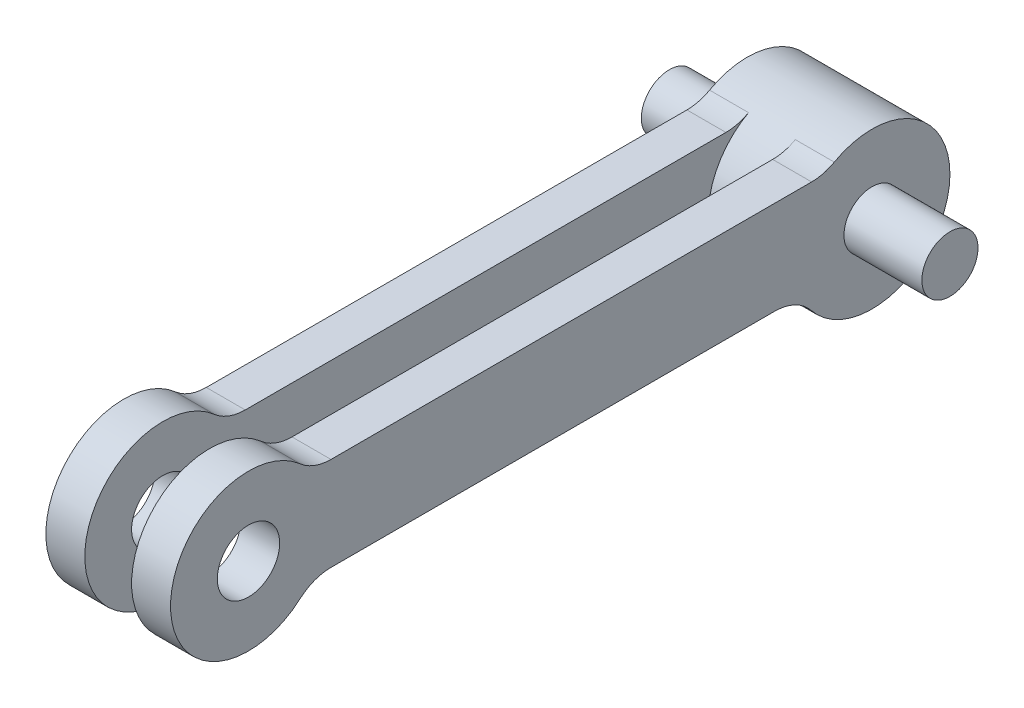
ISO-10303-21;
HEADER;
FILE_DESCRIPTION(('STEP AP214'),'2;1');
FILE_NAME('part.step','',(''),(''),'','','');
FILE_SCHEMA(('AUTOMOTIVE_DESIGN { 1 0 10303 214 1 1 1 1 }'));
ENDSEC;
DATA;
#1=APPLICATION_CONTEXT('core data for automotive mechanical design processes');
#2=APPLICATION_PROTOCOL_DEFINITION('international standard','automotive_design',2000,#1);
#3=PRODUCT_CONTEXT('',#1,'mechanical');
#4=PRODUCT('Part','Part','',(#3));
#5=PRODUCT_RELATED_PRODUCT_CATEGORY('part','',(#4));
#6=PRODUCT_DEFINITION_FORMATION('','',#4);
#7=PRODUCT_DEFINITION_CONTEXT('part definition',#1,'design');
#8=PRODUCT_DEFINITION('design','',#6,#7);
#9=PRODUCT_DEFINITION_SHAPE('','',#8);
#10=(LENGTH_UNIT() NAMED_UNIT(*) SI_UNIT(.MILLI.,.METRE.));
#11=(NAMED_UNIT(*) PLANE_ANGLE_UNIT() SI_UNIT($,.RADIAN.));
#12=(NAMED_UNIT(*) SI_UNIT($,.STERADIAN.) SOLID_ANGLE_UNIT());
#13=UNCERTAINTY_MEASURE_WITH_UNIT(LENGTH_MEASURE(1.E-05),#10,'distance_accuracy_value','');
#14=(GEOMETRIC_REPRESENTATION_CONTEXT(3) GLOBAL_UNCERTAINTY_ASSIGNED_CONTEXT((#13)) GLOBAL_UNIT_ASSIGNED_CONTEXT((#10,
#11,#12)) REPRESENTATION_CONTEXT('',''));
#15=CARTESIAN_POINT('',(0.,0.,0.));
#16=DIRECTION('',(0.,0.,1.));
#17=DIRECTION('',(1.,0.,0.));
#18=AXIS2_PLACEMENT_3D('',#15,#16,#17);
#19=CARTESIAN_POINT('',(0.,0.,0.));
#20=DIRECTION('',(1.,0.,0.));
#21=DIRECTION('',(0.,0.,-1.));
#22=AXIS2_PLACEMENT_3D('',#19,#20,#21);
#23=PLANE('',#22);
#24=CARTESIAN_POINT('',(0.,0.,0.));
#25=DIRECTION('',(1.,0.,0.));
#26=DIRECTION('',(0.,0.,-1.));
#27=AXIS2_PLACEMENT_3D('',#24,#25,#26);
#28=CIRCLE('',#27,2.);
#29=CARTESIAN_POINT('',(0.,0.,-2.));
#30=VERTEX_POINT('',#29);
#31=EDGE_CURVE('E256',#30,#30,#28,.T.);
#32=ORIENTED_EDGE('',*,*,#31,.T.);
#33=EDGE_LOOP('',(#32));
#34=FACE_BOUND('',#33,.T.);
#35=CARTESIAN_POINT('',(0.,5.99999999999999,-36.1270166537926));
#36=DIRECTION('',(1.,0.,0.));
#37=DIRECTION('',(0.,0.,-1.));
#38=AXIS2_PLACEMENT_3D('',#35,#36,#37);
#39=CIRCLE('',#38,3.);
#40=CARTESIAN_POINT('',(0.,2.99999999999999,-36.1270166537926));
#41=VERTEX_POINT('',#40);
#42=CARTESIAN_POINT('',(0.,3.375,-37.5793854086204));
#43=VERTEX_POINT('',#42);
#44=EDGE_CURVE('E87',#41,#43,#39,.T.);
#45=ORIENTED_EDGE('',*,*,#44,.T.);
#46=CARTESIAN_POINT('',(0.,-1.00000000000001,-40.));
#47=DIRECTION('',(1.,0.,0.));
#48=DIRECTION('',(0.,0.,-1.));
#49=AXIS2_PLACEMENT_3D('',#46,#47,#48);
#50=CIRCLE('',#49,5.);
#51=CARTESIAN_POINT('',(0.,-4.125,-36.096876251001));
#52=VERTEX_POINT('',#51);
#53=EDGE_CURVE('E246',#43,#52,#50,.T.);
#54=ORIENTED_EDGE('',*,*,#53,.T.);
#55=CARTESIAN_POINT('',(0.,-6.00000000000001,-33.7550020016016));
#56=DIRECTION('',(1.,0.,0.));
#57=DIRECTION('',(0.,0.,-1.));
#58=AXIS2_PLACEMENT_3D('',#55,#56,#57);
#59=CIRCLE('',#58,3.);
#60=CARTESIAN_POINT('',(0.,-3.00000000000001,-33.7550020016016));
#61=VERTEX_POINT('',#60);
#62=EDGE_CURVE('E320',#52,#61,#59,.T.);
#63=ORIENTED_EDGE('',*,*,#62,.T.);
#64=DIRECTION('',(0.,0.,-1.));
#65=VECTOR('',#64,1.);
#66=CARTESIAN_POINT('',(0.,-3.00000000000001,0.));
#67=LINE('',#66,#65);
#68=CARTESIAN_POINT('',(0.,-3.00000000000001,-5.29150262212916));
#69=VERTEX_POINT('',#68);
#70=EDGE_CURVE('E275',#69,#61,#67,.T.);
#71=ORIENTED_EDGE('',*,*,#70,.F.);
#72=CARTESIAN_POINT('',(0.,-6.00000000000001,-5.29150262212916));
#73=DIRECTION('',(1.,0.,0.));
#74=DIRECTION('',(0.,0.,-1.));
#75=AXIS2_PLACEMENT_3D('',#72,#73,#74);
#76=CIRCLE('',#75,3.);
#77=CARTESIAN_POINT('',(0.,-3.75,-3.30718913883072));
#78=VERTEX_POINT('',#77);
#79=EDGE_CURVE('E314',#69,#78,#76,.T.);
#80=ORIENTED_EDGE('',*,*,#79,.T.);
#81=CARTESIAN_POINT('',(0.,0.,0.));
#82=DIRECTION('',(1.,0.,0.));
#83=DIRECTION('',(0.,0.,-1.));
#84=AXIS2_PLACEMENT_3D('',#81,#82,#83);
#85=CIRCLE('',#84,4.99999999999999);
#86=CARTESIAN_POINT('',(0.,3.74999999999999,-3.30718913883074));
#87=VERTEX_POINT('',#86);
#88=EDGE_CURVE('E266',#87,#78,#85,.T.);
#89=ORIENTED_EDGE('',*,*,#88,.F.);
#90=CARTESIAN_POINT('',(0.,5.99999999999999,-5.29150262212918));
#91=DIRECTION('',(1.,0.,0.));
#92=DIRECTION('',(0.,0.,-1.));
#93=AXIS2_PLACEMENT_3D('',#90,#91,#92);
#94=CIRCLE('',#93,3.);
#95=CARTESIAN_POINT('',(0.,2.99999999999999,-5.29150262212918));
#96=VERTEX_POINT('',#95);
#97=EDGE_CURVE('E80',#87,#96,#94,.T.);
#98=ORIENTED_EDGE('',*,*,#97,.T.);
#99=DIRECTION('',(0.,0.,-1.));
#100=VECTOR('',#99,1.);
#101=CARTESIAN_POINT('',(0.,2.99999999999999,0.));
#102=LINE('',#101,#100);
#103=EDGE_CURVE('E279',#96,#41,#102,.T.);
#104=ORIENTED_EDGE('',*,*,#103,.T.);
#105=EDGE_LOOP('',(#45,#54,#63,#71,#80,#89,#98,#104));
#106=FACE_BOUND('',#105,.T.);
#107=ADVANCED_FACE('F71',(#34,#106),#23,.F.);
#108=CARTESIAN_POINT('',(2.5,0.,0.));
#109=DIRECTION('',(1.,0.,0.));
#110=DIRECTION('',(0.,0.,-1.));
#111=AXIS2_PLACEMENT_3D('',#108,#109,#110);
#112=PLANE('',#111);
#113=CARTESIAN_POINT('',(2.5,-1.00000000000001,-40.));
#114=DIRECTION('',(1.,0.,0.));
#115=DIRECTION('',(0.,0.,-1.));
#116=AXIS2_PLACEMENT_3D('',#113,#114,#115);
#117=CIRCLE('',#116,1.8);
#118=CARTESIAN_POINT('',(2.5,-1.00000000000001,-41.8));
#119=VERTEX_POINT('',#118);
#120=EDGE_CURVE('E241',#119,#119,#117,.T.);
#121=ORIENTED_EDGE('',*,*,#120,.F.);
#122=EDGE_LOOP('',(#121));
#123=FACE_BOUND('',#122,.T.);
#124=CARTESIAN_POINT('',(2.5,0.,0.));
#125=DIRECTION('',(1.,0.,0.));
#126=DIRECTION('',(0.,0.,-1.));
#127=AXIS2_PLACEMENT_3D('',#124,#125,#126);
#128=CIRCLE('',#127,2.);
#129=CARTESIAN_POINT('',(2.5,0.,-2.));
#130=VERTEX_POINT('',#129);
#131=EDGE_CURVE('E252',#130,#130,#128,.T.);
#132=ORIENTED_EDGE('',*,*,#131,.F.);
#133=EDGE_LOOP('',(#132));
#134=FACE_BOUND('',#133,.T.);
#135=DIRECTION('',(0.,0.,-1.));
#136=VECTOR('',#135,1.);
#137=CARTESIAN_POINT('',(2.5,-3.00000000000001,0.));
#138=LINE('',#137,#136);
#139=CARTESIAN_POINT('',(2.5,-3.00000000000001,-5.29150262212916));
#140=VERTEX_POINT('',#139);
#141=CARTESIAN_POINT('',(2.5,-3.00000000000001,-33.7550020016016));
#142=VERTEX_POINT('',#141);
#143=EDGE_CURVE('E270',#140,#142,#138,.T.);
#144=ORIENTED_EDGE('',*,*,#143,.T.);
#145=CARTESIAN_POINT('',(2.5,-6.00000000000001,-33.7550020016016));
#146=DIRECTION('',(1.,0.,0.));
#147=DIRECTION('',(0.,0.,-1.));
#148=AXIS2_PLACEMENT_3D('',#145,#146,#147);
#149=CIRCLE('',#148,3.);
#150=CARTESIAN_POINT('',(2.5,-4.125,-36.096876251001));
#151=VERTEX_POINT('',#150);
#152=EDGE_CURVE('E323',#142,#151,#149,.F.);
#153=ORIENTED_EDGE('',*,*,#152,.T.);
#154=CARTESIAN_POINT('',(2.5,-1.00000000000001,-40.));
#155=DIRECTION('',(1.,0.,0.));
#156=DIRECTION('',(0.,0.,-1.));
#157=AXIS2_PLACEMENT_3D('',#154,#155,#156);
#158=CIRCLE('',#157,5.);
#159=CARTESIAN_POINT('',(2.5,3.375,-37.5793854086204));
#160=VERTEX_POINT('',#159);
#161=EDGE_CURVE('E260',#151,#160,#158,.T.);
#162=ORIENTED_EDGE('',*,*,#161,.T.);
#163=CARTESIAN_POINT('',(2.5,5.99999999999999,-36.1270166537926));
#164=DIRECTION('',(1.,0.,0.));
#165=DIRECTION('',(0.,0.,-1.));
#166=AXIS2_PLACEMENT_3D('',#163,#164,#165);
#167=CIRCLE('',#166,3.);
#168=CARTESIAN_POINT('',(2.5,2.99999999999999,-36.1270166537926));
#169=VERTEX_POINT('',#168);
#170=EDGE_CURVE('E328',#160,#169,#167,.F.);
#171=ORIENTED_EDGE('',*,*,#170,.T.);
#172=DIRECTION('',(0.,0.,-1.));
#173=VECTOR('',#172,1.);
#174=CARTESIAN_POINT('',(2.5,2.99999999999999,0.));
#175=LINE('',#174,#173);
#176=CARTESIAN_POINT('',(2.5,2.99999999999999,-5.29150262212918));
#177=VERTEX_POINT('',#176);
#178=EDGE_CURVE('E271',#177,#169,#175,.T.);
#179=ORIENTED_EDGE('',*,*,#178,.F.);
#180=CARTESIAN_POINT('',(2.5,5.99999999999999,-5.29150262212918));
#181=DIRECTION('',(1.,0.,0.));
#182=DIRECTION('',(0.,0.,-1.));
#183=AXIS2_PLACEMENT_3D('',#180,#181,#182);
#184=CIRCLE('',#183,3.);
#185=CARTESIAN_POINT('',(2.5,3.74999999999999,-3.30718913883074));
#186=VERTEX_POINT('',#185);
#187=EDGE_CURVE('E12',#177,#186,#184,.F.);
#188=ORIENTED_EDGE('',*,*,#187,.T.);
#189=CARTESIAN_POINT('',(2.5,0.,0.));
#190=DIRECTION('',(1.,0.,0.));
#191=DIRECTION('',(0.,0.,-1.));
#192=AXIS2_PLACEMENT_3D('',#189,#190,#191);
#193=CIRCLE('',#192,4.99999999999999);
#194=CARTESIAN_POINT('',(2.5,-3.75,-3.30718913883072));
#195=VERTEX_POINT('',#194);
#196=EDGE_CURVE('E261',#186,#195,#193,.T.);
#197=ORIENTED_EDGE('',*,*,#196,.T.);
#198=CARTESIAN_POINT('',(2.5,-6.00000000000001,-5.29150262212916));
#199=DIRECTION('',(1.,0.,0.));
#200=DIRECTION('',(0.,0.,-1.));
#201=AXIS2_PLACEMENT_3D('',#198,#199,#200);
#202=CIRCLE('',#201,3.);
#203=EDGE_CURVE('E317',#195,#140,#202,.F.);
#204=ORIENTED_EDGE('',*,*,#203,.T.);
#205=EDGE_LOOP('',(#144,#153,#162,#171,#179,#188,#197,#204));
#206=FACE_BOUND('',#205,.T.);
#207=ADVANCED_FACE('F334',(#123,#134,#206),#112,.T.);
#208=CARTESIAN_POINT('',(2.5,0.,0.));
#209=DIRECTION('',(-1.,0.,0.));
#210=DIRECTION('',(0.,0.,1.));
#211=AXIS2_PLACEMENT_3D('',#208,#209,#210);
#212=CYLINDRICAL_SURFACE('',#211,4.99999999999999);
#213=ORIENTED_EDGE('',*,*,#88,.T.);
#214=DIRECTION('',(-1.,0.,0.));
#215=VECTOR('',#214,1.);
#216=CARTESIAN_POINT('',(2.5,-3.75,-3.30718913883072));
#217=LINE('',#216,#215);
#218=EDGE_CURVE('E298',#78,#195,#217,.F.);
#219=ORIENTED_EDGE('',*,*,#218,.T.);
#220=ORIENTED_EDGE('',*,*,#196,.F.);
#221=DIRECTION('',(-1.,0.,0.));
#222=VECTOR('',#221,1.);
#223=CARTESIAN_POINT('',(2.5,3.74999999999999,-3.30718913883074));
#224=LINE('',#223,#222);
#225=EDGE_CURVE('E294',#186,#87,#224,.T.);
#226=ORIENTED_EDGE('',*,*,#225,.T.);
#227=EDGE_LOOP('',(#213,#219,#220,#226));
#228=FACE_BOUND('',#227,.T.);
#229=ADVANCED_FACE('F355',(#228),#212,.T.);
#230=CARTESIAN_POINT('',(2.5,-1.00000000000001,-40.));
#231=DIRECTION('',(-1.,0.,0.));
#232=DIRECTION('',(0.,0.,1.));
#233=AXIS2_PLACEMENT_3D('',#230,#231,#232);
#234=CYLINDRICAL_SURFACE('',#233,5.);
#235=ORIENTED_EDGE('',*,*,#161,.F.);
#236=DIRECTION('',(-1.,0.,0.));
#237=VECTOR('',#236,1.);
#238=CARTESIAN_POINT('',(2.5,-4.12500000000001,-36.096876251001));
#239=LINE('',#238,#237);
#240=EDGE_CURVE('E304',#151,#52,#239,.T.);
#241=ORIENTED_EDGE('',*,*,#240,.T.);
#242=ORIENTED_EDGE('',*,*,#53,.F.);
#243=DIRECTION('',(-1.,0.,0.));
#244=VECTOR('',#243,1.);
#245=CARTESIAN_POINT('',(2.5,3.375,-37.5793854086204));
#246=LINE('',#245,#244);
#247=EDGE_CURVE('E301',#43,#160,#246,.F.);
#248=ORIENTED_EDGE('',*,*,#247,.T.);
#249=EDGE_LOOP('',(#235,#241,#242,#248));
#250=FACE_BOUND('',#249,.T.);
#251=CARTESIAN_POINT('',(-5.5,-1.00000000000001,-40.));
#252=DIRECTION('',(1.,0.,0.));
#253=DIRECTION('',(0.,0.,-1.));
#254=AXIS2_PLACEMENT_3D('',#251,#252,#253);
#255=CIRCLE('',#254,5.);
#256=CARTESIAN_POINT('',(-5.5,-4.125,-36.096876251001));
#257=VERTEX_POINT('',#256);
#258=CARTESIAN_POINT('',(-5.5,3.375,-37.5793854086204));
#259=VERTEX_POINT('',#258);
#260=EDGE_CURVE('E620',#257,#259,#255,.T.);
#261=ORIENTED_EDGE('',*,*,#260,.T.);
#262=DIRECTION('',(1.,0.,0.));
#263=VECTOR('',#262,1.);
#264=CARTESIAN_POINT('',(-5.5,3.375,-37.5793854086204));
#265=LINE('',#264,#263);
#266=CARTESIAN_POINT('',(-3.,3.375,-37.5793854086204));
#267=VERTEX_POINT('',#266);
#268=EDGE_CURVE('E199',#267,#259,#265,.F.);
#269=ORIENTED_EDGE('',*,*,#268,.F.);
#270=CARTESIAN_POINT('',(-3.,-1.00000000000001,-40.));
#271=DIRECTION('',(1.,0.,0.));
#272=DIRECTION('',(0.,0.,-1.));
#273=AXIS2_PLACEMENT_3D('',#270,#271,#272);
#274=CIRCLE('',#273,5.);
#275=CARTESIAN_POINT('',(-3.,-4.125,-36.096876251001));
#276=VERTEX_POINT('',#275);
#277=EDGE_CURVE('E202',#267,#276,#274,.T.);
#278=ORIENTED_EDGE('',*,*,#277,.T.);
#279=DIRECTION('',(1.,0.,0.));
#280=VECTOR('',#279,1.);
#281=CARTESIAN_POINT('',(-5.5,-4.12500000000001,-36.096876251001));
#282=LINE('',#281,#280);
#283=EDGE_CURVE('E186',#257,#276,#282,.T.);
#284=ORIENTED_EDGE('',*,*,#283,.F.);
#285=EDGE_LOOP('',(#261,#269,#278,#284));
#286=FACE_BOUND('',#285,.T.);
#287=ADVANCED_FACE('F203',(#250,#286),#234,.T.);
#288=CARTESIAN_POINT('',(2.5,2.99999999999999,0.));
#289=DIRECTION('',(0.,1.,0.));
#290=DIRECTION('',(0.,0.,1.));
#291=AXIS2_PLACEMENT_3D('',#288,#289,#290);
#292=PLANE('',#291);
#293=ORIENTED_EDGE('',*,*,#178,.T.);
#294=DIRECTION('',(-1.,0.,0.));
#295=VECTOR('',#294,1.);
#296=CARTESIAN_POINT('',(2.5,2.99999999999999,-36.1270166537926));
#297=LINE('',#296,#295);
#298=EDGE_CURVE('E311',#169,#41,#297,.T.);
#299=ORIENTED_EDGE('',*,*,#298,.T.);
#300=ORIENTED_EDGE('',*,*,#103,.F.);
#301=DIRECTION('',(-1.,0.,0.));
#302=VECTOR('',#301,1.);
#303=CARTESIAN_POINT('',(2.5,2.99999999999999,-5.29150262212918));
#304=LINE('',#303,#302);
#305=EDGE_CURVE('E308',#96,#177,#304,.F.);
#306=ORIENTED_EDGE('',*,*,#305,.T.);
#307=EDGE_LOOP('',(#293,#299,#300,#306));
#308=FACE_BOUND('',#307,.T.);
#309=ADVANCED_FACE('F338',(#308),#292,.T.);
#310=CARTESIAN_POINT('',(2.5,-3.00000000000001,0.));
#311=DIRECTION('',(0.,1.,0.));
#312=DIRECTION('',(0.,0.,1.));
#313=AXIS2_PLACEMENT_3D('',#310,#311,#312);
#314=PLANE('',#313);
#315=ORIENTED_EDGE('',*,*,#143,.F.);
#316=DIRECTION('',(1.,0.,0.));
#317=VECTOR('',#316,1.);
#318=CARTESIAN_POINT('',(0.,-3.00000000000001,-5.29150262212916));
#319=LINE('',#318,#317);
#320=EDGE_CURVE('E290',#140,#69,#319,.F.);
#321=ORIENTED_EDGE('',*,*,#320,.T.);
#322=ORIENTED_EDGE('',*,*,#70,.T.);
#323=DIRECTION('',(1.,0.,0.));
#324=VECTOR('',#323,1.);
#325=CARTESIAN_POINT('',(2.5,-3.00000000000001,-33.7550020016016));
#326=LINE('',#325,#324);
#327=EDGE_CURVE('E265',#61,#142,#326,.T.);
#328=ORIENTED_EDGE('',*,*,#327,.T.);
#329=EDGE_LOOP('',(#315,#321,#322,#328));
#330=FACE_BOUND('',#329,.T.);
#331=ADVANCED_FACE('F365',(#330),#314,.F.);
#332=CARTESIAN_POINT('',(-1.2E-05,0.,0.));
#333=DIRECTION('',(1.,0.,0.));
#334=DIRECTION('',(0.,0.,-1.));
#335=AXIS2_PLACEMENT_3D('',#332,#333,#334);
#336=CYLINDRICAL_SURFACE('',#335,2.);
#337=CARTESIAN_POINT('',(2.5,0.,-2.));
#338=CARTESIAN_POINT('',(2.47395833333333,0.,-2.));
#339=CARTESIAN_POINT('',(2.44791666666667,0.,-2.));
#340=CARTESIAN_POINT('',(2.39583333333333,0.,-2.));
#341=CARTESIAN_POINT('',(2.36979166666667,0.,-2.));
#342=CARTESIAN_POINT('',(2.31770833333333,0.,-2.));
#343=CARTESIAN_POINT('',(2.29166666666667,0.,-2.));
#344=CARTESIAN_POINT('',(2.23958333333333,0.,-2.));
#345=CARTESIAN_POINT('',(2.21354166666667,0.,-2.));
#346=CARTESIAN_POINT('',(2.16145833333333,0.,-2.));
#347=CARTESIAN_POINT('',(2.13541666666667,0.,-2.));
#348=CARTESIAN_POINT('',(2.08333333333333,0.,-2.));
#349=CARTESIAN_POINT('',(2.05729166666667,0.,-2.));
#350=CARTESIAN_POINT('',(2.00520833333333,0.,-2.));
#351=CARTESIAN_POINT('',(1.97916666666667,0.,-2.));
#352=CARTESIAN_POINT('',(1.92708333333333,0.,-2.));
#353=CARTESIAN_POINT('',(1.90104166666667,0.,-2.));
#354=CARTESIAN_POINT('',(1.84895833333333,0.,-2.));
#355=CARTESIAN_POINT('',(1.82291666666667,0.,-2.));
#356=CARTESIAN_POINT('',(1.77083333333333,0.,-2.));
#357=CARTESIAN_POINT('',(1.74479166666667,0.,-2.));
#358=CARTESIAN_POINT('',(1.69270833333333,0.,-2.));
#359=CARTESIAN_POINT('',(1.66666666666667,0.,-2.));
#360=CARTESIAN_POINT('',(1.61458333333333,0.,-2.));
#361=CARTESIAN_POINT('',(1.58854166666667,0.,-2.));
#362=CARTESIAN_POINT('',(1.53645833333333,0.,-2.));
#363=CARTESIAN_POINT('',(1.51041666666667,0.,-2.));
#364=CARTESIAN_POINT('',(1.45833333333333,0.,-2.));
#365=CARTESIAN_POINT('',(1.43229166666667,0.,-2.));
#366=CARTESIAN_POINT('',(1.38020833333333,0.,-2.));
#367=CARTESIAN_POINT('',(1.35416666666667,0.,-2.));
#368=CARTESIAN_POINT('',(1.30208333333333,0.,-2.));
#369=CARTESIAN_POINT('',(1.27604166666667,0.,-2.));
#370=CARTESIAN_POINT('',(1.22395833333333,0.,-2.));
#371=CARTESIAN_POINT('',(1.19791666666667,0.,-2.));
#372=CARTESIAN_POINT('',(1.14583333333333,0.,-2.));
#373=CARTESIAN_POINT('',(1.11979166666667,0.,-2.));
#374=CARTESIAN_POINT('',(1.06770833333333,0.,-2.));
#375=CARTESIAN_POINT('',(1.04166666666667,0.,-2.));
#376=CARTESIAN_POINT('',(0.989583333333333,0.,-2.));
#377=CARTESIAN_POINT('',(0.963541666666667,0.,-2.));
#378=CARTESIAN_POINT('',(0.911458333333333,0.,-2.));
#379=CARTESIAN_POINT('',(0.885416666666667,0.,-2.));
#380=CARTESIAN_POINT('',(0.833333333333333,0.,-2.));
#381=CARTESIAN_POINT('',(0.807291666666667,0.,-2.));
#382=CARTESIAN_POINT('',(0.755208333333333,0.,-2.));
#383=CARTESIAN_POINT('',(0.729166666666667,0.,-2.));
#384=CARTESIAN_POINT('',(0.677083333333333,0.,-2.));
#385=CARTESIAN_POINT('',(0.651041666666667,0.,-2.));
#386=CARTESIAN_POINT('',(0.598958333333333,0.,-2.));
#387=CARTESIAN_POINT('',(0.572916666666667,0.,-2.));
#388=CARTESIAN_POINT('',(0.520833333333333,0.,-2.));
#389=CARTESIAN_POINT('',(0.494791666666667,0.,-2.));
#390=CARTESIAN_POINT('',(0.442708333333333,0.,-2.));
#391=CARTESIAN_POINT('',(0.416666666666667,0.,-2.));
#392=CARTESIAN_POINT('',(0.364583333333333,0.,-2.));
#393=CARTESIAN_POINT('',(0.338541666666667,0.,-2.));
#394=CARTESIAN_POINT('',(0.286458333333333,0.,-2.));
#395=CARTESIAN_POINT('',(0.260416666666667,0.,-2.));
#396=CARTESIAN_POINT('',(0.208333333333334,0.,-2.));
#397=CARTESIAN_POINT('',(0.182291666666667,0.,-2.));
#398=CARTESIAN_POINT('',(0.130208333333334,0.,-2.));
#399=CARTESIAN_POINT('',(0.104166666666667,0.,-2.));
#400=CARTESIAN_POINT('',(0.0520833333333336,0.,-2.));
#401=CARTESIAN_POINT('',(0.0260416666666669,0.,-2.));
#402=CARTESIAN_POINT('',(0.,0.,-2.));
#403=B_SPLINE_CURVE_WITH_KNOTS('',3,(#337,#338,#339,#340,#341,#342,#343,#344,#345,#346,#347,
#348,#349,#350,#351,#352,#353,#354,#355,#356,#357,#358,#359,#360,#361,#362,#363,#364,#365,#366,
#367,#368,#369,#370,#371,#372,#373,#374,#375,#376,#377,#378,#379,#380,#381,#382,#383,#384,#385,
#386,#387,#388,#389,#390,#391,#392,#393,#394,#395,#396,#397,#398,#399,#400,#401,#402),
.UNSPECIFIED.,.F.,.F.,(4,2,2,2,2,2,2,2,2,2,2,2,2,2,2,2,2,2,2,2,2,2,2,2,2,2,2,2,2,2,2,2,4),(0.,
0.0781250000000001,0.15625,0.234375,0.3125,0.390625,0.46875,0.546875,0.625,0.703125,0.78125,
0.859374999999999,0.9375,1.015625,1.09375,1.171875,1.25,1.328125,1.40625,1.484375,1.5625,
1.640625,1.71875,1.796875,1.875,1.953125,2.03125,2.109375,2.1875,2.265625,2.34375,2.421875,2.5),.UNSPECIFIED.);
#404=EDGE_CURVE('BSEAM361',#130,#30,#403,.T.);
#405=ORIENTED_EDGE('',*,*,#131,.T.);
#406=ORIENTED_EDGE('',*,*,#31,.F.);
#407=ORIENTED_EDGE('',*,*,#404,.T.);
#408=ORIENTED_EDGE('',*,*,#404,.F.);
#409=EDGE_LOOP('',(#405,#407,#406,#408));
#410=FACE_BOUND('',#409,.T.);
#411=ADVANCED_FACE('F361',(#410),#336,.F.);
#412=CARTESIAN_POINT('',(2.5,-6.00000000000001,-5.29150262212916));
#413=DIRECTION('',(-1.,0.,0.));
#414=DIRECTION('',(0.,0.,1.));
#415=AXIS2_PLACEMENT_3D('',#412,#413,#414);
#416=CYLINDRICAL_SURFACE('',#415,3.);
#417=ORIENTED_EDGE('',*,*,#203,.F.);
#418=ORIENTED_EDGE('',*,*,#218,.F.);
#419=ORIENTED_EDGE('',*,*,#79,.F.);
#420=ORIENTED_EDGE('',*,*,#320,.F.);
#421=EDGE_LOOP('',(#417,#418,#419,#420));
#422=FACE_BOUND('',#421,.T.);
#423=ADVANCED_FACE('F349',(#422),#416,.F.);
#424=CARTESIAN_POINT('',(2.5,-6.00000000000001,-33.7550020016016));
#425=DIRECTION('',(-1.,0.,0.));
#426=DIRECTION('',(0.,0.,1.));
#427=AXIS2_PLACEMENT_3D('',#424,#425,#426);
#428=CYLINDRICAL_SURFACE('',#427,3.);
#429=ORIENTED_EDGE('',*,*,#152,.F.);
#430=ORIENTED_EDGE('',*,*,#327,.F.);
#431=ORIENTED_EDGE('',*,*,#62,.F.);
#432=ORIENTED_EDGE('',*,*,#240,.F.);
#433=EDGE_LOOP('',(#429,#430,#431,#432));
#434=FACE_BOUND('',#433,.T.);
#435=ADVANCED_FACE('F342',(#434),#428,.F.);
#436=CARTESIAN_POINT('',(2.5,5.99999999999999,-36.1270166537926));
#437=DIRECTION('',(-1.,0.,0.));
#438=DIRECTION('',(0.,0.,1.));
#439=AXIS2_PLACEMENT_3D('',#436,#437,#438);
#440=CYLINDRICAL_SURFACE('',#439,3.);
#441=ORIENTED_EDGE('',*,*,#170,.F.);
#442=ORIENTED_EDGE('',*,*,#247,.F.);
#443=ORIENTED_EDGE('',*,*,#44,.F.);
#444=ORIENTED_EDGE('',*,*,#298,.F.);
#445=EDGE_LOOP('',(#441,#442,#443,#444));
#446=FACE_BOUND('',#445,.T.);
#447=ADVANCED_FACE('F340',(#446),#440,.F.);
#448=CARTESIAN_POINT('',(2.5,5.99999999999999,-5.29150262212918));
#449=DIRECTION('',(-1.,0.,0.));
#450=DIRECTION('',(0.,0.,1.));
#451=AXIS2_PLACEMENT_3D('',#448,#449,#450);
#452=CYLINDRICAL_SURFACE('',#451,3.);
#453=ORIENTED_EDGE('',*,*,#187,.F.);
#454=ORIENTED_EDGE('',*,*,#305,.F.);
#455=ORIENTED_EDGE('',*,*,#97,.F.);
#456=ORIENTED_EDGE('',*,*,#225,.F.);
#457=EDGE_LOOP('',(#453,#454,#455,#456));
#458=FACE_BOUND('',#457,.T.);
#459=ADVANCED_FACE('F73',(#458),#452,.F.);
#460=CARTESIAN_POINT('',(7.5,-1.00000000000001,-40.));
#461=DIRECTION('',(-1.,0.,0.));
#462=DIRECTION('',(0.,0.,1.));
#463=AXIS2_PLACEMENT_3D('',#460,#461,#462);
#464=CYLINDRICAL_SURFACE('',#463,1.8);
#465=CARTESIAN_POINT('',(7.5,-1.00000000000001,-40.));
#466=DIRECTION('',(1.,0.,0.));
#467=DIRECTION('',(0.,0.,-1.));
#468=AXIS2_PLACEMENT_3D('',#465,#466,#467);
#469=CIRCLE('',#468,1.8);
#470=CARTESIAN_POINT('',(7.5,-1.00000000000001,-41.8));
#471=VERTEX_POINT('',#470);
#472=EDGE_CURVE('E242',#471,#471,#469,.T.);
#473=ORIENTED_EDGE('',*,*,#472,.F.);
#474=EDGE_LOOP('',(#473));
#475=FACE_BOUND('',#474,.T.);
#476=ORIENTED_EDGE('',*,*,#120,.T.);
#477=EDGE_LOOP('',(#476));
#478=FACE_BOUND('',#477,.T.);
#479=ADVANCED_FACE('F347',(#475,#478),#464,.T.);
#480=CARTESIAN_POINT('',(7.5,0.,0.));
#481=DIRECTION('',(1.,0.,0.));
#482=DIRECTION('',(0.,0.,-1.));
#483=AXIS2_PLACEMENT_3D('',#480,#481,#482);
#484=PLANE('',#483);
#485=ORIENTED_EDGE('',*,*,#472,.T.);
#486=EDGE_LOOP('',(#485));
#487=FACE_BOUND('',#486,.T.);
#488=ADVANCED_FACE('F463',(#487),#484,.T.);
#489=CARTESIAN_POINT('',(-3.,0.,0.));
#490=DIRECTION('',(-1.,0.,0.));
#491=DIRECTION('',(0.,0.,-1.));
#492=AXIS2_PLACEMENT_3D('',#489,#490,#491);
#493=PLANE('',#492);
#494=CARTESIAN_POINT('',(-3.,0.,0.));
#495=DIRECTION('',(1.,0.,0.));
#496=DIRECTION('',(0.,0.,-1.));
#497=AXIS2_PLACEMENT_3D('',#494,#495,#496);
#498=CIRCLE('',#497,2.);
#499=CARTESIAN_POINT('',(-3.,0.,-2.));
#500=VERTEX_POINT('',#499);
#501=EDGE_CURVE('E616',#500,#500,#498,.T.);
#502=ORIENTED_EDGE('',*,*,#501,.F.);
#503=EDGE_LOOP('',(#502));
#504=FACE_BOUND('',#503,.T.);
#505=CARTESIAN_POINT('',(-3.,5.99999999999999,-36.1270166537926));
#506=DIRECTION('',(1.,0.,0.));
#507=DIRECTION('',(0.,0.,-1.));
#508=AXIS2_PLACEMENT_3D('',#505,#506,#507);
#509=CIRCLE('',#508,3.);
#510=CARTESIAN_POINT('',(-3.,2.99999999999999,-36.1270166537926));
#511=VERTEX_POINT('',#510);
#512=EDGE_CURVE('E220',#511,#267,#509,.T.);
#513=ORIENTED_EDGE('',*,*,#512,.F.);
#514=DIRECTION('',(0.,0.,-1.));
#515=VECTOR('',#514,1.);
#516=CARTESIAN_POINT('',(-3.,2.99999999999999,0.));
#517=LINE('',#516,#515);
#518=CARTESIAN_POINT('',(-3.,2.99999999999999,-5.29150262212918));
#519=VERTEX_POINT('',#518);
#520=EDGE_CURVE('E638',#519,#511,#517,.T.);
#521=ORIENTED_EDGE('',*,*,#520,.F.);
#522=CARTESIAN_POINT('',(-3.,5.99999999999999,-5.29150262212918));
#523=DIRECTION('',(1.,0.,0.));
#524=DIRECTION('',(0.,0.,-1.));
#525=AXIS2_PLACEMENT_3D('',#522,#523,#524);
#526=CIRCLE('',#525,3.);
#527=CARTESIAN_POINT('',(-3.,3.74999999999999,-3.30718913883074));
#528=VERTEX_POINT('',#527);
#529=EDGE_CURVE('E233',#528,#519,#526,.T.);
#530=ORIENTED_EDGE('',*,*,#529,.F.);
#531=CARTESIAN_POINT('',(-3.,0.,0.));
#532=DIRECTION('',(1.,0.,0.));
#533=DIRECTION('',(0.,0.,-1.));
#534=AXIS2_PLACEMENT_3D('',#531,#532,#533);
#535=CIRCLE('',#534,4.99999999999999);
#536=CARTESIAN_POINT('',(-3.,-3.75,-3.30718913883072));
#537=VERTEX_POINT('',#536);
#538=EDGE_CURVE('E626',#528,#537,#535,.T.);
#539=ORIENTED_EDGE('',*,*,#538,.T.);
#540=CARTESIAN_POINT('',(-3.,-6.00000000000001,-5.29150262212916));
#541=DIRECTION('',(1.,0.,0.));
#542=DIRECTION('',(0.,0.,-1.));
#543=AXIS2_PLACEMENT_3D('',#540,#541,#542);
#544=CIRCLE('',#543,3.);
#545=CARTESIAN_POINT('',(-3.,-3.00000000000001,-5.29150262212916));
#546=VERTEX_POINT('',#545);
#547=EDGE_CURVE('E223',#546,#537,#544,.T.);
#548=ORIENTED_EDGE('',*,*,#547,.F.);
#549=DIRECTION('',(0.,0.,-1.));
#550=VECTOR('',#549,1.);
#551=CARTESIAN_POINT('',(-3.,-3.00000000000001,0.));
#552=LINE('',#551,#550);
#553=CARTESIAN_POINT('',(-3.,-3.00000000000001,-33.7550020016016));
#554=VERTEX_POINT('',#553);
#555=EDGE_CURVE('E214',#546,#554,#552,.T.);
#556=ORIENTED_EDGE('',*,*,#555,.T.);
#557=CARTESIAN_POINT('',(-3.,-6.00000000000001,-33.7550020016016));
#558=DIRECTION('',(1.,0.,0.));
#559=DIRECTION('',(0.,0.,-1.));
#560=AXIS2_PLACEMENT_3D('',#557,#558,#559);
#561=CIRCLE('',#560,3.);
#562=EDGE_CURVE('E190',#276,#554,#561,.T.);
#563=ORIENTED_EDGE('',*,*,#562,.F.);
#564=ORIENTED_EDGE('',*,*,#277,.F.);
#565=EDGE_LOOP('',(#513,#521,#530,#539,#548,#556,#563,#564));
#566=FACE_BOUND('',#565,.T.);
#567=ADVANCED_FACE('F211',(#504,#566),#493,.F.);
#568=CARTESIAN_POINT('',(-5.5,0.,0.));
#569=DIRECTION('',(-1.,0.,0.));
#570=DIRECTION('',(0.,0.,-1.));
#571=AXIS2_PLACEMENT_3D('',#568,#569,#570);
#572=PLANE('',#571);
#573=CARTESIAN_POINT('',(-5.5,-1.00000000000001,-40.));
#574=DIRECTION('',(1.,0.,0.));
#575=DIRECTION('',(0.,0.,-1.));
#576=AXIS2_PLACEMENT_3D('',#573,#574,#575);
#577=CIRCLE('',#576,1.8);
#578=CARTESIAN_POINT('',(-5.5,-1.00000000000001,-41.8));
#579=VERTEX_POINT('',#578);
#580=EDGE_CURVE('E607',#579,#579,#577,.T.);
#581=ORIENTED_EDGE('',*,*,#580,.T.);
#582=EDGE_LOOP('',(#581));
#583=FACE_BOUND('',#582,.T.);
#584=CARTESIAN_POINT('',(-5.5,0.,0.));
#585=DIRECTION('',(1.,0.,0.));
#586=DIRECTION('',(0.,0.,-1.));
#587=AXIS2_PLACEMENT_3D('',#584,#585,#586);
#588=CIRCLE('',#587,2.);
#589=CARTESIAN_POINT('',(-5.5,0.,-2.));
#590=VERTEX_POINT('',#589);
#591=EDGE_CURVE('E208',#590,#590,#588,.T.);
#592=ORIENTED_EDGE('',*,*,#591,.T.);
#593=EDGE_LOOP('',(#592));
#594=FACE_BOUND('',#593,.T.);
#595=DIRECTION('',(0.,0.,-1.));
#596=VECTOR('',#595,1.);
#597=CARTESIAN_POINT('',(-5.5,-3.00000000000001,0.));
#598=LINE('',#597,#596);
#599=CARTESIAN_POINT('',(-5.5,-3.00000000000001,-5.29150262212916));
#600=VERTEX_POINT('',#599);
#601=CARTESIAN_POINT('',(-5.5,-3.00000000000001,-33.7550020016016));
#602=VERTEX_POINT('',#601);
#603=EDGE_CURVE('E630',#600,#602,#598,.T.);
#604=ORIENTED_EDGE('',*,*,#603,.F.);
#605=CARTESIAN_POINT('',(-5.5,-6.00000000000001,-5.29150262212916));
#606=DIRECTION('',(1.,0.,0.));
#607=DIRECTION('',(0.,0.,-1.));
#608=AXIS2_PLACEMENT_3D('',#605,#606,#607);
#609=CIRCLE('',#608,3.);
#610=CARTESIAN_POINT('',(-5.5,-3.75,-3.30718913883072));
#611=VERTEX_POINT('',#610);
#612=EDGE_CURVE('E216',#611,#600,#609,.F.);
#613=ORIENTED_EDGE('',*,*,#612,.F.);
#614=CARTESIAN_POINT('',(-5.5,0.,0.));
#615=DIRECTION('',(1.,0.,0.));
#616=DIRECTION('',(0.,0.,-1.));
#617=AXIS2_PLACEMENT_3D('',#614,#615,#616);
#618=CIRCLE('',#617,4.99999999999999);
#619=CARTESIAN_POINT('',(-5.5,3.74999999999999,-3.30718913883074));
#620=VERTEX_POINT('',#619);
#621=EDGE_CURVE('E621',#620,#611,#618,.T.);
#622=ORIENTED_EDGE('',*,*,#621,.F.);
#623=CARTESIAN_POINT('',(-5.5,5.99999999999999,-5.29150262212918));
#624=DIRECTION('',(1.,0.,0.));
#625=DIRECTION('',(0.,0.,-1.));
#626=AXIS2_PLACEMENT_3D('',#623,#624,#625);
#627=CIRCLE('',#626,3.);
#628=CARTESIAN_POINT('',(-5.5,2.99999999999999,-5.29150262212918));
#629=VERTEX_POINT('',#628);
#630=EDGE_CURVE('E237',#629,#620,#627,.F.);
#631=ORIENTED_EDGE('',*,*,#630,.F.);
#632=DIRECTION('',(0.,0.,-1.));
#633=VECTOR('',#632,1.);
#634=CARTESIAN_POINT('',(-5.5,2.99999999999999,0.));
#635=LINE('',#634,#633);
#636=CARTESIAN_POINT('',(-5.5,2.99999999999999,-36.1270166537926));
#637=VERTEX_POINT('',#636);
#638=EDGE_CURVE('E631',#629,#637,#635,.T.);
#639=ORIENTED_EDGE('',*,*,#638,.T.);
#640=CARTESIAN_POINT('',(-5.5,5.99999999999999,-36.1270166537926));
#641=DIRECTION('',(1.,0.,0.));
#642=DIRECTION('',(0.,0.,-1.));
#643=AXIS2_PLACEMENT_3D('',#640,#641,#642);
#644=CIRCLE('',#643,3.);
#645=EDGE_CURVE('E229',#259,#637,#644,.F.);
#646=ORIENTED_EDGE('',*,*,#645,.F.);
#647=ORIENTED_EDGE('',*,*,#260,.F.);
#648=CARTESIAN_POINT('',(-5.5,-6.00000000000001,-33.7550020016016));
#649=DIRECTION('',(1.,0.,0.));
#650=DIRECTION('',(0.,0.,-1.));
#651=AXIS2_PLACEMENT_3D('',#648,#649,#650);
#652=CIRCLE('',#651,3.);
#653=EDGE_CURVE('E193',#602,#257,#652,.F.);
#654=ORIENTED_EDGE('',*,*,#653,.F.);
#655=EDGE_LOOP('',(#604,#613,#622,#631,#639,#646,#647,#654));
#656=FACE_BOUND('',#655,.T.);
#657=ADVANCED_FACE('F469',(#583,#594,#656),#572,.T.);
#658=CARTESIAN_POINT('',(-5.5,0.,0.));
#659=DIRECTION('',(1.,0.,0.));
#660=DIRECTION('',(0.,0.,1.));
#661=AXIS2_PLACEMENT_3D('',#658,#659,#660);
#662=CYLINDRICAL_SURFACE('',#661,4.99999999999999);
#663=ORIENTED_EDGE('',*,*,#538,.F.);
#664=DIRECTION('',(1.,0.,0.));
#665=VECTOR('',#664,1.);
#666=CARTESIAN_POINT('',(-5.5,3.74999999999999,-3.30718913883074));
#667=LINE('',#666,#665);
#668=EDGE_CURVE('E651',#620,#528,#667,.T.);
#669=ORIENTED_EDGE('',*,*,#668,.F.);
#670=ORIENTED_EDGE('',*,*,#621,.T.);
#671=DIRECTION('',(1.,0.,0.));
#672=VECTOR('',#671,1.);
#673=CARTESIAN_POINT('',(-5.5,-3.75,-3.30718913883072));
#674=LINE('',#673,#672);
#675=EDGE_CURVE('E654',#537,#611,#674,.F.);
#676=ORIENTED_EDGE('',*,*,#675,.F.);
#677=EDGE_LOOP('',(#663,#669,#670,#676));
#678=FACE_BOUND('',#677,.T.);
#679=ADVANCED_FACE('F481',(#678),#662,.T.);
#680=CARTESIAN_POINT('',(-5.5,2.99999999999999,0.));
#681=DIRECTION('',(0.,1.,0.));
#682=DIRECTION('',(0.,0.,1.));
#683=AXIS2_PLACEMENT_3D('',#680,#681,#682);
#684=PLANE('',#683);
#685=ORIENTED_EDGE('',*,*,#638,.F.);
#686=DIRECTION('',(1.,0.,0.));
#687=VECTOR('',#686,1.);
#688=CARTESIAN_POINT('',(-5.5,2.99999999999999,-5.29150262212918));
#689=LINE('',#688,#687);
#690=EDGE_CURVE('E198',#519,#629,#689,.F.);
#691=ORIENTED_EDGE('',*,*,#690,.F.);
#692=ORIENTED_EDGE('',*,*,#520,.T.);
#693=DIRECTION('',(1.,0.,0.));
#694=VECTOR('',#693,1.);
#695=CARTESIAN_POINT('',(-5.5,2.99999999999999,-36.1270166537926));
#696=LINE('',#695,#694);
#697=EDGE_CURVE('E661',#637,#511,#696,.T.);
#698=ORIENTED_EDGE('',*,*,#697,.F.);
#699=EDGE_LOOP('',(#685,#691,#692,#698));
#700=FACE_BOUND('',#699,.T.);
#701=ADVANCED_FACE('F491',(#700),#684,.T.);
#702=CARTESIAN_POINT('',(-5.5,-3.00000000000001,0.));
#703=DIRECTION('',(0.,1.,0.));
#704=DIRECTION('',(0.,0.,1.));
#705=AXIS2_PLACEMENT_3D('',#702,#703,#704);
#706=PLANE('',#705);
#707=ORIENTED_EDGE('',*,*,#603,.T.);
#708=DIRECTION('',(-1.,0.,0.));
#709=VECTOR('',#708,1.);
#710=CARTESIAN_POINT('',(-5.5,-3.00000000000001,-33.7550020016016));
#711=LINE('',#710,#709);
#712=EDGE_CURVE('E625',#554,#602,#711,.T.);
#713=ORIENTED_EDGE('',*,*,#712,.F.);
#714=ORIENTED_EDGE('',*,*,#555,.F.);
#715=DIRECTION('',(-1.,0.,0.));
#716=VECTOR('',#715,1.);
#717=CARTESIAN_POINT('',(-3.,-3.00000000000001,-5.29150262212916));
#718=LINE('',#717,#716);
#719=EDGE_CURVE('E648',#600,#546,#718,.F.);
#720=ORIENTED_EDGE('',*,*,#719,.F.);
#721=EDGE_LOOP('',(#707,#713,#714,#720));
#722=FACE_BOUND('',#721,.T.);
#723=ADVANCED_FACE('F501',(#722),#706,.F.);
#724=CARTESIAN_POINT('',(-2.999988,0.,0.));
#725=DIRECTION('',(-1.,0.,0.));
#726=DIRECTION('',(0.,0.,-1.));
#727=AXIS2_PLACEMENT_3D('',#724,#725,#726);
#728=CYLINDRICAL_SURFACE('',#727,2.);
#729=CARTESIAN_POINT('',(-5.5,0.,-2.));
#730=CARTESIAN_POINT('',(-5.47395833333333,0.,-2.));
#731=CARTESIAN_POINT('',(-5.44791666666667,0.,-2.));
#732=CARTESIAN_POINT('',(-5.39583333333333,0.,-2.));
#733=CARTESIAN_POINT('',(-5.36979166666667,0.,-2.));
#734=CARTESIAN_POINT('',(-5.31770833333333,0.,-2.));
#735=CARTESIAN_POINT('',(-5.29166666666667,0.,-2.));
#736=CARTESIAN_POINT('',(-5.23958333333333,0.,-2.));
#737=CARTESIAN_POINT('',(-5.21354166666667,0.,-2.));
#738=CARTESIAN_POINT('',(-5.16145833333333,0.,-2.));
#739=CARTESIAN_POINT('',(-5.13541666666667,0.,-2.));
#740=CARTESIAN_POINT('',(-5.08333333333333,0.,-2.));
#741=CARTESIAN_POINT('',(-5.05729166666667,0.,-2.));
#742=CARTESIAN_POINT('',(-5.00520833333333,0.,-2.));
#743=CARTESIAN_POINT('',(-4.97916666666667,0.,-2.));
#744=CARTESIAN_POINT('',(-4.92708333333333,0.,-2.));
#745=CARTESIAN_POINT('',(-4.90104166666667,0.,-2.));
#746=CARTESIAN_POINT('',(-4.84895833333333,0.,-2.));
#747=CARTESIAN_POINT('',(-4.82291666666667,0.,-2.));
#748=CARTESIAN_POINT('',(-4.77083333333333,0.,-2.));
#749=CARTESIAN_POINT('',(-4.74479166666667,0.,-2.));
#750=CARTESIAN_POINT('',(-4.69270833333333,0.,-2.));
#751=CARTESIAN_POINT('',(-4.66666666666667,0.,-2.));
#752=CARTESIAN_POINT('',(-4.61458333333333,0.,-2.));
#753=CARTESIAN_POINT('',(-4.58854166666667,0.,-2.));
#754=CARTESIAN_POINT('',(-4.53645833333333,0.,-2.));
#755=CARTESIAN_POINT('',(-4.51041666666667,0.,-2.));
#756=CARTESIAN_POINT('',(-4.45833333333333,0.,-2.));
#757=CARTESIAN_POINT('',(-4.43229166666667,0.,-2.));
#758=CARTESIAN_POINT('',(-4.38020833333333,0.,-2.));
#759=CARTESIAN_POINT('',(-4.35416666666667,0.,-2.));
#760=CARTESIAN_POINT('',(-4.30208333333333,0.,-2.));
#761=CARTESIAN_POINT('',(-4.27604166666667,0.,-2.));
#762=CARTESIAN_POINT('',(-4.22395833333333,0.,-2.));
#763=CARTESIAN_POINT('',(-4.19791666666667,0.,-2.));
#764=CARTESIAN_POINT('',(-4.14583333333333,0.,-2.));
#765=CARTESIAN_POINT('',(-4.11979166666667,0.,-2.));
#766=CARTESIAN_POINT('',(-4.06770833333333,0.,-2.));
#767=CARTESIAN_POINT('',(-4.04166666666667,0.,-2.));
#768=CARTESIAN_POINT('',(-3.98958333333333,0.,-2.));
#769=CARTESIAN_POINT('',(-3.96354166666667,0.,-2.));
#770=CARTESIAN_POINT('',(-3.91145833333333,0.,-2.));
#771=CARTESIAN_POINT('',(-3.88541666666667,0.,-2.));
#772=CARTESIAN_POINT('',(-3.83333333333333,0.,-2.));
#773=CARTESIAN_POINT('',(-3.80729166666667,0.,-2.));
#774=CARTESIAN_POINT('',(-3.75520833333333,0.,-2.));
#775=CARTESIAN_POINT('',(-3.72916666666667,0.,-2.));
#776=CARTESIAN_POINT('',(-3.67708333333333,0.,-2.));
#777=CARTESIAN_POINT('',(-3.65104166666667,0.,-2.));
#778=CARTESIAN_POINT('',(-3.59895833333333,0.,-2.));
#779=CARTESIAN_POINT('',(-3.57291666666667,0.,-2.));
#780=CARTESIAN_POINT('',(-3.52083333333333,0.,-2.));
#781=CARTESIAN_POINT('',(-3.49479166666667,0.,-2.));
#782=CARTESIAN_POINT('',(-3.44270833333333,0.,-2.));
#783=CARTESIAN_POINT('',(-3.41666666666667,0.,-2.));
#784=CARTESIAN_POINT('',(-3.36458333333333,0.,-2.));
#785=CARTESIAN_POINT('',(-3.33854166666667,0.,-2.));
#786=CARTESIAN_POINT('',(-3.28645833333333,0.,-2.));
#787=CARTESIAN_POINT('',(-3.26041666666667,0.,-2.));
#788=CARTESIAN_POINT('',(-3.20833333333333,0.,-2.));
#789=CARTESIAN_POINT('',(-3.18229166666667,0.,-2.));
#790=CARTESIAN_POINT('',(-3.13020833333333,0.,-2.));
#791=CARTESIAN_POINT('',(-3.10416666666667,0.,-2.));
#792=CARTESIAN_POINT('',(-3.05208333333333,0.,-2.));
#793=CARTESIAN_POINT('',(-3.02604166666667,0.,-2.));
#794=CARTESIAN_POINT('',(-3.,0.,-2.));
#795=B_SPLINE_CURVE_WITH_KNOTS('',3,(#729,#730,#731,#732,#733,#734,#735,#736,#737,#738,#739,
#740,#741,#742,#743,#744,#745,#746,#747,#748,#749,#750,#751,#752,#753,#754,#755,#756,#757,#758,
#759,#760,#761,#762,#763,#764,#765,#766,#767,#768,#769,#770,#771,#772,#773,#774,#775,#776,#777,
#778,#779,#780,#781,#782,#783,#784,#785,#786,#787,#788,#789,#790,#791,#792,#793,#794),
.UNSPECIFIED.,.F.,.F.,(4,2,2,2,2,2,2,2,2,2,2,2,2,2,2,2,2,2,2,2,2,2,2,2,2,2,2,2,2,2,2,2,4),(0.,
0.0781250000000001,0.15625,0.234375,0.3125,0.390625,0.46875,0.546875,0.625,0.703125,0.78125,
0.859375,0.9375,1.015625,1.09375,1.171875,1.25,1.328125,1.40625,1.484375,1.5625,1.640625,
1.71875,1.796875,1.875,1.953125,2.03125,2.109375,2.1875,2.265625,2.34375,2.421875,2.5),.UNSPECIFIED.);
#796=EDGE_CURVE('BSEAM511',#590,#500,#795,.T.);
#797=ORIENTED_EDGE('',*,*,#591,.F.);
#798=ORIENTED_EDGE('',*,*,#501,.T.);
#799=ORIENTED_EDGE('',*,*,#796,.T.);
#800=ORIENTED_EDGE('',*,*,#796,.F.);
#801=EDGE_LOOP('',(#797,#799,#798,#800));
#802=FACE_BOUND('',#801,.T.);
#803=ADVANCED_FACE('F511',(#802),#728,.F.);
#804=CARTESIAN_POINT('',(-5.5,-6.00000000000001,-5.29150262212916));
#805=DIRECTION('',(1.,0.,0.));
#806=DIRECTION('',(0.,0.,1.));
#807=AXIS2_PLACEMENT_3D('',#804,#805,#806);
#808=CYLINDRICAL_SURFACE('',#807,3.);
#809=ORIENTED_EDGE('',*,*,#612,.T.);
#810=ORIENTED_EDGE('',*,*,#719,.T.);
#811=ORIENTED_EDGE('',*,*,#547,.T.);
#812=ORIENTED_EDGE('',*,*,#675,.T.);
#813=EDGE_LOOP('',(#809,#810,#811,#812));
#814=FACE_BOUND('',#813,.T.);
#815=ADVANCED_FACE('F521',(#814),#808,.F.);
#816=CARTESIAN_POINT('',(-5.5,-6.00000000000001,-33.7550020016016));
#817=DIRECTION('',(1.,0.,0.));
#818=DIRECTION('',(0.,0.,1.));
#819=AXIS2_PLACEMENT_3D('',#816,#817,#818);
#820=CYLINDRICAL_SURFACE('',#819,3.);
#821=ORIENTED_EDGE('',*,*,#653,.T.);
#822=ORIENTED_EDGE('',*,*,#283,.T.);
#823=ORIENTED_EDGE('',*,*,#562,.T.);
#824=ORIENTED_EDGE('',*,*,#712,.T.);
#825=EDGE_LOOP('',(#821,#822,#823,#824));
#826=FACE_BOUND('',#825,.T.);
#827=ADVANCED_FACE('F188',(#826),#820,.F.);
#828=CARTESIAN_POINT('',(-5.5,5.99999999999999,-36.1270166537926));
#829=DIRECTION('',(1.,0.,0.));
#830=DIRECTION('',(0.,0.,1.));
#831=AXIS2_PLACEMENT_3D('',#828,#829,#830);
#832=CYLINDRICAL_SURFACE('',#831,3.);
#833=ORIENTED_EDGE('',*,*,#645,.T.);
#834=ORIENTED_EDGE('',*,*,#697,.T.);
#835=ORIENTED_EDGE('',*,*,#512,.T.);
#836=ORIENTED_EDGE('',*,*,#268,.T.);
#837=EDGE_LOOP('',(#833,#834,#835,#836));
#838=FACE_BOUND('',#837,.T.);
#839=ADVANCED_FACE('F540',(#838),#832,.F.);
#840=CARTESIAN_POINT('',(-5.5,5.99999999999999,-5.29150262212918));
#841=DIRECTION('',(1.,0.,0.));
#842=DIRECTION('',(0.,0.,1.));
#843=AXIS2_PLACEMENT_3D('',#840,#841,#842);
#844=CYLINDRICAL_SURFACE('',#843,3.);
#845=ORIENTED_EDGE('',*,*,#630,.T.);
#846=ORIENTED_EDGE('',*,*,#668,.T.);
#847=ORIENTED_EDGE('',*,*,#529,.T.);
#848=ORIENTED_EDGE('',*,*,#690,.T.);
#849=EDGE_LOOP('',(#845,#846,#847,#848));
#850=FACE_BOUND('',#849,.T.);
#851=ADVANCED_FACE('F549',(#850),#844,.F.);
#852=CARTESIAN_POINT('',(-10.5,-1.00000000000001,-40.));
#853=DIRECTION('',(1.,0.,0.));
#854=DIRECTION('',(0.,0.,1.));
#855=AXIS2_PLACEMENT_3D('',#852,#853,#854);
#856=CYLINDRICAL_SURFACE('',#855,1.8);
#857=CARTESIAN_POINT('',(-10.5,-1.00000000000001,-40.));
#858=DIRECTION('',(1.,0.,0.));
#859=DIRECTION('',(0.,0.,-1.));
#860=AXIS2_PLACEMENT_3D('',#857,#858,#859);
#861=CIRCLE('',#860,1.8);
#862=CARTESIAN_POINT('',(-10.5,-1.00000000000001,-41.8));
#863=VERTEX_POINT('',#862);
#864=EDGE_CURVE('E209',#863,#863,#861,.T.);
#865=ORIENTED_EDGE('',*,*,#864,.T.);
#866=EDGE_LOOP('',(#865));
#867=FACE_BOUND('',#866,.T.);
#868=ORIENTED_EDGE('',*,*,#580,.F.);
#869=EDGE_LOOP('',(#868));
#870=FACE_BOUND('',#869,.T.);
#871=ADVANCED_FACE('F559',(#867,#870),#856,.T.);
#872=CARTESIAN_POINT('',(-10.5,0.,0.));
#873=DIRECTION('',(-1.,0.,0.));
#874=DIRECTION('',(0.,0.,-1.));
#875=AXIS2_PLACEMENT_3D('',#872,#873,#874);
#876=PLANE('',#875);
#877=ORIENTED_EDGE('',*,*,#864,.F.);
#878=EDGE_LOOP('',(#877));
#879=FACE_BOUND('',#878,.T.);
#880=ADVANCED_FACE('F569',(#879),#876,.T.);
#881=CLOSED_SHELL('',(#107,#207,#229,#287,#309,#331,#411,#423,#435,#447,#459,#479,#488,#567,
#657,#679,#701,#723,#803,#815,#827,#839,#851,#871,#880));
#882=MANIFOLD_SOLID_BREP('B2',#881);
#883=ADVANCED_BREP_SHAPE_REPRESENTATION('',(#18,#882),#14);
#884=SHAPE_DEFINITION_REPRESENTATION(#9,#883);
ENDSEC;
END-ISO-10303-21;
